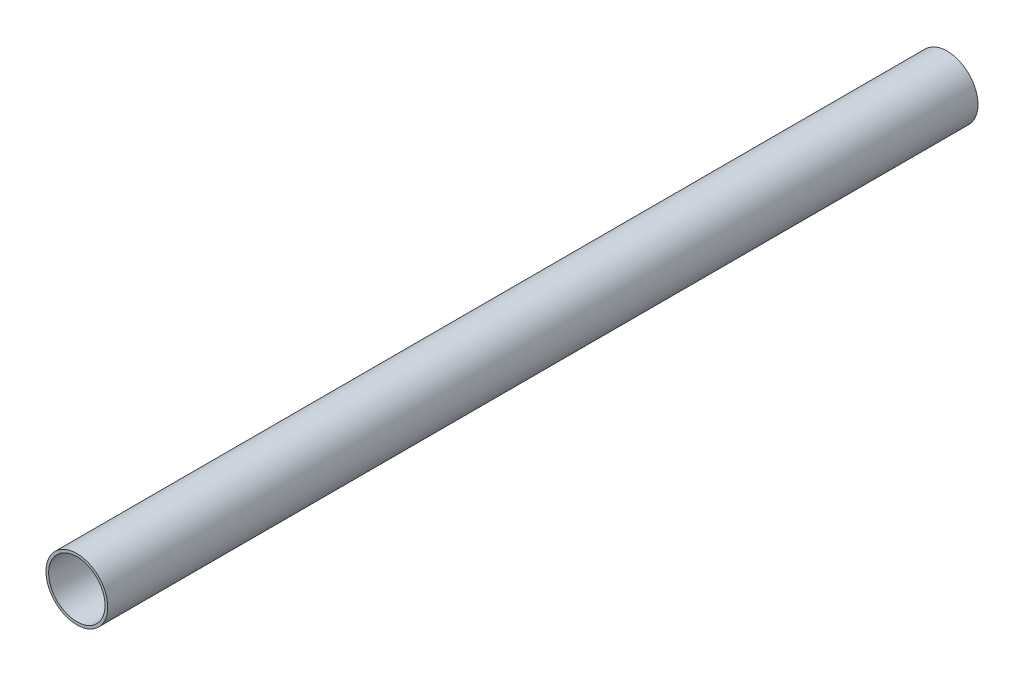
ISO-10303-21;
HEADER;
FILE_DESCRIPTION(('STEP AP214'),'2;1');
FILE_NAME('part.step','',(''),(''),'','','');
FILE_SCHEMA(('AUTOMOTIVE_DESIGN { 1 0 10303 214 1 1 1 1 }'));
ENDSEC;
DATA;
#1=APPLICATION_CONTEXT('core data for automotive mechanical design processes');
#2=APPLICATION_PROTOCOL_DEFINITION('international standard','automotive_design',2000,#1);
#3=PRODUCT_CONTEXT('',#1,'mechanical');
#4=PRODUCT('Part','Part','',(#3));
#5=PRODUCT_RELATED_PRODUCT_CATEGORY('part','',(#4));
#6=PRODUCT_DEFINITION_FORMATION('','',#4);
#7=PRODUCT_DEFINITION_CONTEXT('part definition',#1,'design');
#8=PRODUCT_DEFINITION('design','',#6,#7);
#9=PRODUCT_DEFINITION_SHAPE('','',#8);
#10=(LENGTH_UNIT() NAMED_UNIT(*) SI_UNIT(.MILLI.,.METRE.));
#11=(NAMED_UNIT(*) PLANE_ANGLE_UNIT() SI_UNIT($,.RADIAN.));
#12=(NAMED_UNIT(*) SI_UNIT($,.STERADIAN.) SOLID_ANGLE_UNIT());
#13=UNCERTAINTY_MEASURE_WITH_UNIT(LENGTH_MEASURE(1.E-05),#10,'distance_accuracy_value','');
#14=(GEOMETRIC_REPRESENTATION_CONTEXT(3) GLOBAL_UNCERTAINTY_ASSIGNED_CONTEXT((#13)) GLOBAL_UNIT_ASSIGNED_CONTEXT((#10,
#11,#12)) REPRESENTATION_CONTEXT('',''));
#15=CARTESIAN_POINT('',(0.,0.,0.));
#16=DIRECTION('',(0.,0.,1.));
#17=DIRECTION('',(1.,0.,0.));
#18=AXIS2_PLACEMENT_3D('',#15,#16,#17);
#19=CARTESIAN_POINT('',(0.,0.,448.945));
#20=DIRECTION('',(0.,0.,1.));
#21=DIRECTION('',(1.,0.,0.));
#22=AXIS2_PLACEMENT_3D('',#19,#20,#21);
#23=PLANE('',#22);
#24=CARTESIAN_POINT('',(0.,0.,448.945));
#25=DIRECTION('',(0.,0.,1.));
#26=DIRECTION('',(1.,0.,0.));
#27=AXIS2_PLACEMENT_3D('',#24,#25,#26);
#28=CIRCLE('',#27,15.9385);
#29=CARTESIAN_POINT('',(15.9385,0.,448.945));
#30=VERTEX_POINT('',#29);
#31=EDGE_CURVE('E10',#30,#30,#28,.T.);
#32=ORIENTED_EDGE('',*,*,#31,.T.);
#33=EDGE_LOOP('',(#32));
#34=FACE_BOUND('',#33,.T.);
#35=CARTESIAN_POINT('',(0.,0.,448.945));
#36=DIRECTION('',(0.,0.,1.));
#37=DIRECTION('',(1.,0.,0.));
#38=AXIS2_PLACEMENT_3D('',#35,#36,#37);
#39=CIRCLE('',#38,14.5415);
#40=CARTESIAN_POINT('',(14.5415,0.,448.945));
#41=VERTEX_POINT('',#40);
#42=EDGE_CURVE('E54',#41,#41,#39,.T.);
#43=ORIENTED_EDGE('',*,*,#42,.F.);
#44=EDGE_LOOP('',(#43));
#45=FACE_BOUND('',#44,.T.);
#46=ADVANCED_FACE('F41',(#34,#45),#23,.T.);
#47=CARTESIAN_POINT('',(0.,0.,0.));
#48=DIRECTION('',(0.,0.,1.));
#49=DIRECTION('',(1.,0.,0.));
#50=AXIS2_PLACEMENT_3D('',#47,#48,#49);
#51=PLANE('',#50);
#52=CARTESIAN_POINT('',(0.,0.,0.));
#53=DIRECTION('',(0.,0.,1.));
#54=DIRECTION('',(1.,0.,0.));
#55=AXIS2_PLACEMENT_3D('',#52,#53,#54);
#56=CIRCLE('',#55,15.9385);
#57=CARTESIAN_POINT('',(15.9385,0.,0.));
#58=VERTEX_POINT('',#57);
#59=EDGE_CURVE('E45',#58,#58,#56,.T.);
#60=ORIENTED_EDGE('',*,*,#59,.F.);
#61=EDGE_LOOP('',(#60));
#62=FACE_BOUND('',#61,.T.);
#63=CARTESIAN_POINT('',(0.,0.,0.));
#64=DIRECTION('',(0.,0.,1.));
#65=DIRECTION('',(1.,0.,0.));
#66=AXIS2_PLACEMENT_3D('',#63,#64,#65);
#67=CIRCLE('',#66,14.5415);
#68=CARTESIAN_POINT('',(14.5415,0.,0.));
#69=VERTEX_POINT('',#68);
#70=EDGE_CURVE('E56',#69,#69,#67,.T.);
#71=ORIENTED_EDGE('',*,*,#70,.T.);
#72=EDGE_LOOP('',(#71));
#73=FACE_BOUND('',#72,.T.);
#74=ADVANCED_FACE('F68',(#62,#73),#51,.F.);
#75=CARTESIAN_POINT('',(0.,0.,448.945));
#76=DIRECTION('',(0.,0.,-1.));
#77=DIRECTION('',(-1.,0.,0.));
#78=AXIS2_PLACEMENT_3D('',#75,#76,#77);
#79=CYLINDRICAL_SURFACE('',#78,15.9385);
#80=ORIENTED_EDGE('',*,*,#31,.F.);
#81=EDGE_LOOP('',(#80));
#82=FACE_BOUND('',#81,.T.);
#83=ORIENTED_EDGE('',*,*,#59,.T.);
#84=EDGE_LOOP('',(#83));
#85=FACE_BOUND('',#84,.T.);
#86=ADVANCED_FACE('F43',(#82,#85),#79,.T.);
#87=CARTESIAN_POINT('',(0.,0.,448.945));
#88=DIRECTION('',(0.,0.,-1.));
#89=DIRECTION('',(-1.,0.,0.));
#90=AXIS2_PLACEMENT_3D('',#87,#88,#89);
#91=CYLINDRICAL_SURFACE('',#90,14.5415);
#92=ORIENTED_EDGE('',*,*,#42,.T.);
#93=EDGE_LOOP('',(#92));
#94=FACE_BOUND('',#93,.T.);
#95=ORIENTED_EDGE('',*,*,#70,.F.);
#96=EDGE_LOOP('',(#95));
#97=FACE_BOUND('',#96,.T.);
#98=ADVANCED_FACE('F64',(#94,#97),#91,.F.);
#99=CLOSED_SHELL('',(#46,#74,#86,#98));
#100=MANIFOLD_SOLID_BREP('B2',#99);
#101=ADVANCED_BREP_SHAPE_REPRESENTATION('',(#18,#100),#14);
#102=SHAPE_DEFINITION_REPRESENTATION(#9,#101);
ENDSEC;
END-ISO-10303-21;
